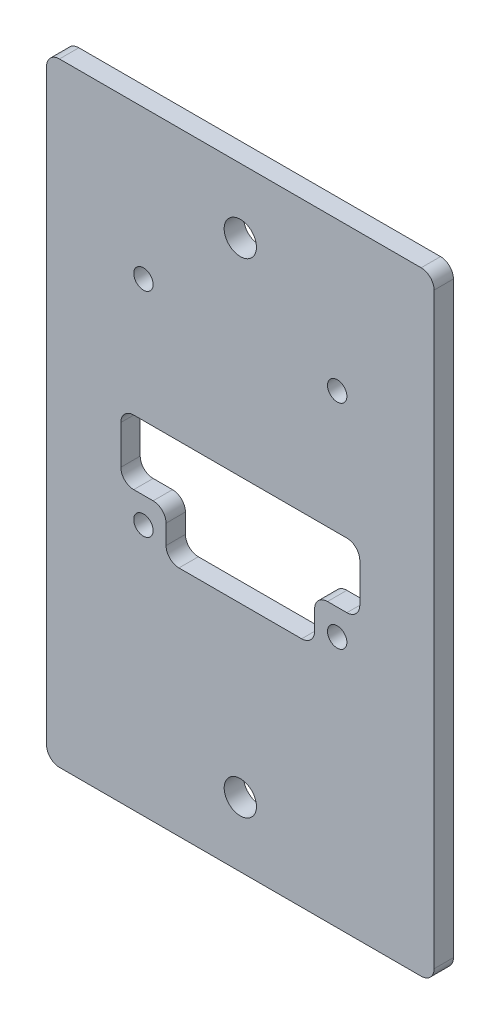
ISO-10303-21;
HEADER;
FILE_DESCRIPTION(('STEP AP214'),'2;1');
FILE_NAME('part.step','',(''),(''),'','','');
FILE_SCHEMA(('AUTOMOTIVE_DESIGN { 1 0 10303 214 1 1 1 1 }'));
ENDSEC;
DATA;
#1=APPLICATION_CONTEXT('core data for automotive mechanical design processes');
#2=APPLICATION_PROTOCOL_DEFINITION('international standard','automotive_design',2000,#1);
#3=PRODUCT_CONTEXT('',#1,'mechanical');
#4=PRODUCT('Part','Part','',(#3));
#5=PRODUCT_RELATED_PRODUCT_CATEGORY('part','',(#4));
#6=PRODUCT_DEFINITION_FORMATION('','',#4);
#7=PRODUCT_DEFINITION_CONTEXT('part definition',#1,'design');
#8=PRODUCT_DEFINITION('design','',#6,#7);
#9=PRODUCT_DEFINITION_SHAPE('','',#8);
#10=(LENGTH_UNIT() NAMED_UNIT(*) SI_UNIT(.MILLI.,.METRE.));
#11=(NAMED_UNIT(*) PLANE_ANGLE_UNIT() SI_UNIT($,.RADIAN.));
#12=(NAMED_UNIT(*) SI_UNIT($,.STERADIAN.) SOLID_ANGLE_UNIT());
#13=UNCERTAINTY_MEASURE_WITH_UNIT(LENGTH_MEASURE(1.E-05),#10,'distance_accuracy_value','');
#14=(GEOMETRIC_REPRESENTATION_CONTEXT(3) GLOBAL_UNCERTAINTY_ASSIGNED_CONTEXT((#13)) GLOBAL_UNIT_ASSIGNED_CONTEXT((#10,
#11,#12)) REPRESENTATION_CONTEXT('',''));
#15=CARTESIAN_POINT('',(0.,0.,0.));
#16=DIRECTION('',(0.,0.,1.));
#17=DIRECTION('',(1.,0.,0.));
#18=AXIS2_PLACEMENT_3D('',#15,#16,#17);
#19=CARTESIAN_POINT('',(-28.,-45.5,3.));
#20=DIRECTION('',(0.,0.,-1.));
#21=DIRECTION('',(-1.,0.,0.));
#22=AXIS2_PLACEMENT_3D('',#19,#20,#21);
#23=PLANE('',#22);
#24=CARTESIAN_POINT('',(15.,-8.5,3.));
#25=DIRECTION('',(0.,0.,1.));
#26=DIRECTION('',(1.,0.,0.));
#27=AXIS2_PLACEMENT_3D('',#24,#25,#26);
#28=CIRCLE('',#27,1.5);
#29=CARTESIAN_POINT('',(16.5,-8.5,3.));
#30=VERTEX_POINT('',#29);
#31=EDGE_CURVE('E374',#30,#30,#28,.T.);
#32=ORIENTED_EDGE('',*,*,#31,.F.);
#33=EDGE_LOOP('',(#32));
#34=FACE_BOUND('',#33,.T.);
#35=CARTESIAN_POINT('',(-15.,-8.5,3.));
#36=DIRECTION('',(0.,0.,1.));
#37=DIRECTION('',(1.,0.,0.));
#38=AXIS2_PLACEMENT_3D('',#35,#36,#37);
#39=CIRCLE('',#38,1.5);
#40=CARTESIAN_POINT('',(-13.5,-8.5,3.));
#41=VERTEX_POINT('',#40);
#42=EDGE_CURVE('E382',#41,#41,#39,.T.);
#43=ORIENTED_EDGE('',*,*,#42,.F.);
#44=EDGE_LOOP('',(#43));
#45=FACE_BOUND('',#44,.T.);
#46=CARTESIAN_POINT('',(15.,24.5,3.));
#47=DIRECTION('',(0.,0.,1.));
#48=DIRECTION('',(1.,0.,0.));
#49=AXIS2_PLACEMENT_3D('',#46,#47,#48);
#50=CIRCLE('',#49,1.5);
#51=CARTESIAN_POINT('',(16.5,24.5,3.));
#52=VERTEX_POINT('',#51);
#53=EDGE_CURVE('E390',#52,#52,#50,.T.);
#54=ORIENTED_EDGE('',*,*,#53,.F.);
#55=EDGE_LOOP('',(#54));
#56=FACE_BOUND('',#55,.T.);
#57=CARTESIAN_POINT('',(-15.,24.5,3.));
#58=DIRECTION('',(0.,0.,1.));
#59=DIRECTION('',(1.,0.,0.));
#60=AXIS2_PLACEMENT_3D('',#57,#58,#59);
#61=CIRCLE('',#60,1.5);
#62=CARTESIAN_POINT('',(-13.5,24.5,3.));
#63=VERTEX_POINT('',#62);
#64=EDGE_CURVE('E398',#63,#63,#61,.T.);
#65=ORIENTED_EDGE('',*,*,#64,.F.);
#66=EDGE_LOOP('',(#65));
#67=FACE_BOUND('',#66,.T.);
#68=CARTESIAN_POINT('',(0.,-37.5,3.));
#69=DIRECTION('',(0.,0.,1.));
#70=DIRECTION('',(1.,0.,0.));
#71=AXIS2_PLACEMENT_3D('',#68,#69,#70);
#72=CIRCLE('',#71,2.5);
#73=CARTESIAN_POINT('',(2.5,-37.5,3.));
#74=VERTEX_POINT('',#73);
#75=EDGE_CURVE('E406',#74,#74,#72,.T.);
#76=ORIENTED_EDGE('',*,*,#75,.F.);
#77=EDGE_LOOP('',(#76));
#78=FACE_BOUND('',#77,.T.);
#79=CARTESIAN_POINT('',(0.,37.5,3.));
#80=DIRECTION('',(0.,0.,1.));
#81=DIRECTION('',(1.,0.,0.));
#82=AXIS2_PLACEMENT_3D('',#79,#80,#81);
#83=CIRCLE('',#82,2.5);
#84=CARTESIAN_POINT('',(2.5,37.5,3.));
#85=VERTEX_POINT('',#84);
#86=EDGE_CURVE('E414',#85,#85,#83,.T.);
#87=ORIENTED_EDGE('',*,*,#86,.F.);
#88=EDGE_LOOP('',(#87));
#89=FACE_BOUND('',#88,.T.);
#90=CARTESIAN_POINT('',(-28.,-45.5,3.));
#91=DIRECTION('',(0.,0.,1.));
#92=DIRECTION('',(-1.,0.,0.));
#93=AXIS2_PLACEMENT_3D('',#90,#91,#92);
#94=CIRCLE('',#93,2.);
#95=CARTESIAN_POINT('',(-30.,-45.5,3.));
#96=VERTEX_POINT('',#95);
#97=CARTESIAN_POINT('',(-28.,-47.5,3.));
#98=VERTEX_POINT('',#97);
#99=EDGE_CURVE('E422',#96,#98,#94,.T.);
#100=ORIENTED_EDGE('',*,*,#99,.T.);
#101=DIRECTION('',(1.,0.,0.));
#102=VECTOR('',#101,1.);
#103=CARTESIAN_POINT('',(-28.,-47.5,3.));
#104=LINE('',#103,#102);
#105=CARTESIAN_POINT('',(28.,-47.5,3.));
#106=VERTEX_POINT('',#105);
#107=EDGE_CURVE('E426',#98,#106,#104,.T.);
#108=ORIENTED_EDGE('',*,*,#107,.T.);
#109=CARTESIAN_POINT('',(28.,-45.5,3.));
#110=DIRECTION('',(0.,0.,1.));
#111=DIRECTION('',(1.,0.,0.));
#112=AXIS2_PLACEMENT_3D('',#109,#110,#111);
#113=CIRCLE('',#112,2.);
#114=CARTESIAN_POINT('',(30.,-45.5,3.));
#115=VERTEX_POINT('',#114);
#116=EDGE_CURVE('E430',#106,#115,#113,.T.);
#117=ORIENTED_EDGE('',*,*,#116,.T.);
#118=DIRECTION('',(0.,1.,0.));
#119=VECTOR('',#118,1.);
#120=CARTESIAN_POINT('',(30.,-45.5,3.));
#121=LINE('',#120,#119);
#122=CARTESIAN_POINT('',(30.,45.5,3.));
#123=VERTEX_POINT('',#122);
#124=EDGE_CURVE('E433',#115,#123,#121,.T.);
#125=ORIENTED_EDGE('',*,*,#124,.T.);
#126=CARTESIAN_POINT('',(28.,45.5,3.));
#127=DIRECTION('',(0.,0.,1.));
#128=DIRECTION('',(-1.,0.,0.));
#129=AXIS2_PLACEMENT_3D('',#126,#127,#128);
#130=CIRCLE('',#129,2.);
#131=CARTESIAN_POINT('',(28.,47.5,3.));
#132=VERTEX_POINT('',#131);
#133=EDGE_CURVE('E436',#123,#132,#130,.T.);
#134=ORIENTED_EDGE('',*,*,#133,.T.);
#135=DIRECTION('',(-1.,0.,0.));
#136=VECTOR('',#135,1.);
#137=CARTESIAN_POINT('',(-28.,47.5,3.));
#138=LINE('',#137,#136);
#139=CARTESIAN_POINT('',(-28.,47.5,3.));
#140=VERTEX_POINT('',#139);
#141=EDGE_CURVE('E439',#132,#140,#138,.T.);
#142=ORIENTED_EDGE('',*,*,#141,.T.);
#143=CARTESIAN_POINT('',(-28.,45.5,3.));
#144=DIRECTION('',(0.,0.,1.));
#145=DIRECTION('',(-1.,0.,0.));
#146=AXIS2_PLACEMENT_3D('',#143,#144,#145);
#147=CIRCLE('',#146,2.);
#148=CARTESIAN_POINT('',(-30.,45.5,3.));
#149=VERTEX_POINT('',#148);
#150=EDGE_CURVE('E442',#140,#149,#147,.T.);
#151=ORIENTED_EDGE('',*,*,#150,.T.);
#152=DIRECTION('',(0.,-1.,0.));
#153=VECTOR('',#152,1.);
#154=CARTESIAN_POINT('',(-30.,-45.5,3.));
#155=LINE('',#154,#153);
#156=EDGE_CURVE('E445',#149,#96,#155,.T.);
#157=ORIENTED_EDGE('',*,*,#156,.T.);
#158=EDGE_LOOP('',(#100,#108,#117,#125,#134,#142,#151,#157));
#159=FACE_BOUND('',#158,.T.);
#160=CARTESIAN_POINT('',(-16.5,-2.5,3.));
#161=DIRECTION('',(0.,0.,1.));
#162=DIRECTION('',(-1.,0.,0.));
#163=AXIS2_PLACEMENT_3D('',#160,#161,#162);
#164=CIRCLE('',#163,2.);
#165=CARTESIAN_POINT('',(-18.5,-2.49999999999999,3.));
#166=VERTEX_POINT('',#165);
#167=CARTESIAN_POINT('',(-16.5,-4.5,3.));
#168=VERTEX_POINT('',#167);
#169=EDGE_CURVE('E205',#166,#168,#164,.T.);
#170=ORIENTED_EDGE('',*,*,#169,.F.);
#171=DIRECTION('',(0.,-1.,0.));
#172=VECTOR('',#171,1.);
#173=CARTESIAN_POINT('',(-18.5,-2.49999999999999,3.));
#174=LINE('',#173,#172);
#175=CARTESIAN_POINT('',(-18.5,3.49999999999999,3.));
#176=VERTEX_POINT('',#175);
#177=EDGE_CURVE('E270',#176,#166,#174,.T.);
#178=ORIENTED_EDGE('',*,*,#177,.F.);
#179=CARTESIAN_POINT('',(-16.5,3.5,3.));
#180=DIRECTION('',(0.,0.,1.));
#181=DIRECTION('',(-1.,0.,0.));
#182=AXIS2_PLACEMENT_3D('',#179,#180,#181);
#183=CIRCLE('',#182,2.);
#184=CARTESIAN_POINT('',(-16.5,5.5,3.));
#185=VERTEX_POINT('',#184);
#186=EDGE_CURVE('E267',#185,#176,#183,.T.);
#187=ORIENTED_EDGE('',*,*,#186,.F.);
#188=DIRECTION('',(-1.,0.,0.));
#189=VECTOR('',#188,1.);
#190=CARTESIAN_POINT('',(-16.5,5.5,3.));
#191=LINE('',#190,#189);
#192=CARTESIAN_POINT('',(16.5,5.5,3.));
#193=VERTEX_POINT('',#192);
#194=EDGE_CURVE('E264',#193,#185,#191,.T.);
#195=ORIENTED_EDGE('',*,*,#194,.F.);
#196=CARTESIAN_POINT('',(16.5,3.5,3.));
#197=DIRECTION('',(0.,0.,1.));
#198=DIRECTION('',(-1.,0.,0.));
#199=AXIS2_PLACEMENT_3D('',#196,#197,#198);
#200=CIRCLE('',#199,2.);
#201=CARTESIAN_POINT('',(18.5,3.49999999999999,3.));
#202=VERTEX_POINT('',#201);
#203=EDGE_CURVE('E261',#202,#193,#200,.T.);
#204=ORIENTED_EDGE('',*,*,#203,.F.);
#205=DIRECTION('',(0.,1.,0.));
#206=VECTOR('',#205,1.);
#207=CARTESIAN_POINT('',(18.5,-2.49999999999999,3.));
#208=LINE('',#207,#206);
#209=CARTESIAN_POINT('',(18.5,-2.5,3.));
#210=VERTEX_POINT('',#209);
#211=EDGE_CURVE('E258',#210,#202,#208,.T.);
#212=ORIENTED_EDGE('',*,*,#211,.F.);
#213=CARTESIAN_POINT('',(16.5,-2.5,3.));
#214=DIRECTION('',(0.,0.,1.));
#215=DIRECTION('',(1.,0.,0.));
#216=AXIS2_PLACEMENT_3D('',#213,#214,#215);
#217=CIRCLE('',#216,2.);
#218=CARTESIAN_POINT('',(16.5,-4.5,3.));
#219=VERTEX_POINT('',#218);
#220=EDGE_CURVE('E255',#219,#210,#217,.T.);
#221=ORIENTED_EDGE('',*,*,#220,.F.);
#222=DIRECTION('',(1.,0.,0.));
#223=VECTOR('',#222,1.);
#224=CARTESIAN_POINT('',(13.5,-4.5,3.));
#225=LINE('',#224,#223);
#226=CARTESIAN_POINT('',(13.5,-4.5,3.));
#227=VERTEX_POINT('',#226);
#228=EDGE_CURVE('E252',#227,#219,#225,.T.);
#229=ORIENTED_EDGE('',*,*,#228,.F.);
#230=CARTESIAN_POINT('',(13.5,-6.5,3.));
#231=DIRECTION('',(0.,0.,-1.));
#232=DIRECTION('',(1.,0.,0.));
#233=AXIS2_PLACEMENT_3D('',#230,#231,#232);
#234=CIRCLE('',#233,2.);
#235=CARTESIAN_POINT('',(11.5,-6.50000000000001,3.));
#236=VERTEX_POINT('',#235);
#237=EDGE_CURVE('E249',#236,#227,#234,.T.);
#238=ORIENTED_EDGE('',*,*,#237,.F.);
#239=DIRECTION('',(0.,1.,0.));
#240=VECTOR('',#239,1.);
#241=CARTESIAN_POINT('',(11.5,-9.49999999999999,3.));
#242=LINE('',#241,#240);
#243=CARTESIAN_POINT('',(11.5,-9.49999999999999,3.));
#244=VERTEX_POINT('',#243);
#245=EDGE_CURVE('E246',#244,#236,#242,.T.);
#246=ORIENTED_EDGE('',*,*,#245,.F.);
#247=CARTESIAN_POINT('',(9.5,-9.5,3.));
#248=DIRECTION('',(0.,0.,1.));
#249=DIRECTION('',(-1.,0.,0.));
#250=AXIS2_PLACEMENT_3D('',#247,#248,#249);
#251=CIRCLE('',#250,2.);
#252=CARTESIAN_POINT('',(9.49999999999999,-11.5,3.));
#253=VERTEX_POINT('',#252);
#254=EDGE_CURVE('E243',#253,#244,#251,.T.);
#255=ORIENTED_EDGE('',*,*,#254,.F.);
#256=DIRECTION('',(1.,0.,0.));
#257=VECTOR('',#256,1.);
#258=CARTESIAN_POINT('',(-9.49999999999999,-11.5,3.));
#259=LINE('',#258,#257);
#260=CARTESIAN_POINT('',(-9.49999999999999,-11.5,3.));
#261=VERTEX_POINT('',#260);
#262=EDGE_CURVE('E240',#261,#253,#259,.T.);
#263=ORIENTED_EDGE('',*,*,#262,.F.);
#264=CARTESIAN_POINT('',(-9.5,-9.5,3.));
#265=DIRECTION('',(0.,0.,1.));
#266=DIRECTION('',(1.,0.,0.));
#267=AXIS2_PLACEMENT_3D('',#264,#265,#266);
#268=CIRCLE('',#267,2.);
#269=CARTESIAN_POINT('',(-11.5,-9.49999999999999,3.));
#270=VERTEX_POINT('',#269);
#271=EDGE_CURVE('E237',#270,#261,#268,.T.);
#272=ORIENTED_EDGE('',*,*,#271,.F.);
#273=DIRECTION('',(0.,-1.,0.));
#274=VECTOR('',#273,1.);
#275=CARTESIAN_POINT('',(-11.5,-9.49999999999999,3.));
#276=LINE('',#275,#274);
#277=CARTESIAN_POINT('',(-11.5,-6.50000000000001,3.));
#278=VERTEX_POINT('',#277);
#279=EDGE_CURVE('E232',#278,#270,#276,.T.);
#280=ORIENTED_EDGE('',*,*,#279,.F.);
#281=CARTESIAN_POINT('',(-13.5,-6.5,3.));
#282=DIRECTION('',(0.,0.,-1.));
#283=DIRECTION('',(1.,0.,0.));
#284=AXIS2_PLACEMENT_3D('',#281,#282,#283);
#285=CIRCLE('',#284,2.);
#286=CARTESIAN_POINT('',(-13.5,-4.5,3.));
#287=VERTEX_POINT('',#286);
#288=EDGE_CURVE('E228',#287,#278,#285,.T.);
#289=ORIENTED_EDGE('',*,*,#288,.F.);
#290=DIRECTION('',(1.,0.,0.));
#291=VECTOR('',#290,1.);
#292=CARTESIAN_POINT('',(-13.5,-4.5,3.));
#293=LINE('',#292,#291);
#294=EDGE_CURVE('E214',#168,#287,#293,.T.);
#295=ORIENTED_EDGE('',*,*,#294,.F.);
#296=EDGE_LOOP('',(#170,#178,#187,#195,#204,#212,#221,#229,#238,#246,#255,#263,#272,#280,#289,#295));
#297=FACE_BOUND('',#296,.T.);
#298=ADVANCED_FACE('F43',(#34,#45,#56,#67,#78,#89,#159,#297),#23,.F.);
#299=CARTESIAN_POINT('',(-28.,-45.5,0.));
#300=DIRECTION('',(0.,0.,-1.));
#301=DIRECTION('',(-1.,0.,0.));
#302=AXIS2_PLACEMENT_3D('',#299,#300,#301);
#303=PLANE('',#302);
#304=CARTESIAN_POINT('',(-15.,-8.5,0.));
#305=DIRECTION('',(0.,0.,1.));
#306=DIRECTION('',(1.,0.,0.));
#307=AXIS2_PLACEMENT_3D('',#304,#305,#306);
#308=CIRCLE('',#307,1.5);
#309=CARTESIAN_POINT('',(-13.5,-8.5,0.));
#310=VERTEX_POINT('',#309);
#311=EDGE_CURVE('E378',#310,#310,#308,.T.);
#312=ORIENTED_EDGE('',*,*,#311,.T.);
#313=EDGE_LOOP('',(#312));
#314=FACE_BOUND('',#313,.T.);
#315=CARTESIAN_POINT('',(-15.,24.5,0.));
#316=DIRECTION('',(0.,0.,1.));
#317=DIRECTION('',(1.,0.,0.));
#318=AXIS2_PLACEMENT_3D('',#315,#316,#317);
#319=CIRCLE('',#318,1.5);
#320=CARTESIAN_POINT('',(-13.5,24.5,0.));
#321=VERTEX_POINT('',#320);
#322=EDGE_CURVE('E394',#321,#321,#319,.T.);
#323=ORIENTED_EDGE('',*,*,#322,.T.);
#324=EDGE_LOOP('',(#323));
#325=FACE_BOUND('',#324,.T.);
#326=CARTESIAN_POINT('',(0.,37.5,0.));
#327=DIRECTION('',(0.,0.,1.));
#328=DIRECTION('',(1.,0.,0.));
#329=AXIS2_PLACEMENT_3D('',#326,#327,#328);
#330=CIRCLE('',#329,2.5);
#331=CARTESIAN_POINT('',(2.5,37.5,0.));
#332=VERTEX_POINT('',#331);
#333=EDGE_CURVE('E410',#332,#332,#330,.T.);
#334=ORIENTED_EDGE('',*,*,#333,.T.);
#335=EDGE_LOOP('',(#334));
#336=FACE_BOUND('',#335,.T.);
#337=CARTESIAN_POINT('',(-28.,-45.5,0.));
#338=DIRECTION('',(0.,0.,1.));
#339=DIRECTION('',(-1.,0.,0.));
#340=AXIS2_PLACEMENT_3D('',#337,#338,#339);
#341=CIRCLE('',#340,2.);
#342=CARTESIAN_POINT('',(-30.,-45.5,0.));
#343=VERTEX_POINT('',#342);
#344=CARTESIAN_POINT('',(-28.,-47.5,0.));
#345=VERTEX_POINT('',#344);
#346=EDGE_CURVE('E418',#343,#345,#341,.T.);
#347=ORIENTED_EDGE('',*,*,#346,.F.);
#348=DIRECTION('',(0.,-1.,0.));
#349=VECTOR('',#348,1.);
#350=CARTESIAN_POINT('',(-30.,-45.5,0.));
#351=LINE('',#350,#349);
#352=CARTESIAN_POINT('',(-30.,45.5,0.));
#353=VERTEX_POINT('',#352);
#354=EDGE_CURVE('E427',#353,#343,#351,.T.);
#355=ORIENTED_EDGE('',*,*,#354,.F.);
#356=CARTESIAN_POINT('',(-28.,45.5,0.));
#357=DIRECTION('',(0.,0.,1.));
#358=DIRECTION('',(-1.,0.,0.));
#359=AXIS2_PLACEMENT_3D('',#356,#357,#358);
#360=CIRCLE('',#359,2.);
#361=CARTESIAN_POINT('',(-28.,47.5,0.));
#362=VERTEX_POINT('',#361);
#363=EDGE_CURVE('E467',#362,#353,#360,.T.);
#364=ORIENTED_EDGE('',*,*,#363,.F.);
#365=DIRECTION('',(-1.,0.,0.));
#366=VECTOR('',#365,1.);
#367=CARTESIAN_POINT('',(-28.,47.5,0.));
#368=LINE('',#367,#366);
#369=CARTESIAN_POINT('',(28.,47.5,0.));
#370=VERTEX_POINT('',#369);
#371=EDGE_CURVE('E464',#370,#362,#368,.T.);
#372=ORIENTED_EDGE('',*,*,#371,.F.);
#373=CARTESIAN_POINT('',(28.,45.5,0.));
#374=DIRECTION('',(0.,0.,1.));
#375=DIRECTION('',(-1.,0.,0.));
#376=AXIS2_PLACEMENT_3D('',#373,#374,#375);
#377=CIRCLE('',#376,2.);
#378=CARTESIAN_POINT('',(30.,45.5,0.));
#379=VERTEX_POINT('',#378);
#380=EDGE_CURVE('E461',#379,#370,#377,.T.);
#381=ORIENTED_EDGE('',*,*,#380,.F.);
#382=DIRECTION('',(0.,1.,0.));
#383=VECTOR('',#382,1.);
#384=CARTESIAN_POINT('',(30.,-45.5,0.));
#385=LINE('',#384,#383);
#386=CARTESIAN_POINT('',(30.,-45.5,0.));
#387=VERTEX_POINT('',#386);
#388=EDGE_CURVE('E458',#387,#379,#385,.T.);
#389=ORIENTED_EDGE('',*,*,#388,.F.);
#390=CARTESIAN_POINT('',(28.,-45.5,0.));
#391=DIRECTION('',(0.,0.,1.));
#392=DIRECTION('',(1.,0.,0.));
#393=AXIS2_PLACEMENT_3D('',#390,#391,#392);
#394=CIRCLE('',#393,2.);
#395=CARTESIAN_POINT('',(28.,-47.5,0.));
#396=VERTEX_POINT('',#395);
#397=EDGE_CURVE('E455',#396,#387,#394,.T.);
#398=ORIENTED_EDGE('',*,*,#397,.F.);
#399=DIRECTION('',(1.,0.,0.));
#400=VECTOR('',#399,1.);
#401=CARTESIAN_POINT('',(-28.,-47.5,0.));
#402=LINE('',#401,#400);
#403=EDGE_CURVE('E452',#345,#396,#402,.T.);
#404=ORIENTED_EDGE('',*,*,#403,.F.);
#405=EDGE_LOOP('',(#347,#355,#364,#372,#381,#389,#398,#404));
#406=FACE_BOUND('',#405,.T.);
#407=CARTESIAN_POINT('',(0.,-37.5,0.));
#408=DIRECTION('',(0.,0.,1.));
#409=DIRECTION('',(1.,0.,0.));
#410=AXIS2_PLACEMENT_3D('',#407,#408,#409);
#411=CIRCLE('',#410,2.5);
#412=CARTESIAN_POINT('',(2.5,-37.5,0.));
#413=VERTEX_POINT('',#412);
#414=EDGE_CURVE('E402',#413,#413,#411,.T.);
#415=ORIENTED_EDGE('',*,*,#414,.T.);
#416=EDGE_LOOP('',(#415));
#417=FACE_BOUND('',#416,.T.);
#418=CARTESIAN_POINT('',(15.,24.5,0.));
#419=DIRECTION('',(0.,0.,1.));
#420=DIRECTION('',(1.,0.,0.));
#421=AXIS2_PLACEMENT_3D('',#418,#419,#420);
#422=CIRCLE('',#421,1.5);
#423=CARTESIAN_POINT('',(16.5,24.5,0.));
#424=VERTEX_POINT('',#423);
#425=EDGE_CURVE('E386',#424,#424,#422,.T.);
#426=ORIENTED_EDGE('',*,*,#425,.T.);
#427=EDGE_LOOP('',(#426));
#428=FACE_BOUND('',#427,.T.);
#429=CARTESIAN_POINT('',(15.,-8.5,0.));
#430=DIRECTION('',(0.,0.,1.));
#431=DIRECTION('',(1.,0.,0.));
#432=AXIS2_PLACEMENT_3D('',#429,#430,#431);
#433=CIRCLE('',#432,1.5);
#434=CARTESIAN_POINT('',(16.5,-8.5,0.));
#435=VERTEX_POINT('',#434);
#436=EDGE_CURVE('E223',#435,#435,#433,.T.);
#437=ORIENTED_EDGE('',*,*,#436,.T.);
#438=EDGE_LOOP('',(#437));
#439=FACE_BOUND('',#438,.T.);
#440=DIRECTION('',(0.,-1.,0.));
#441=VECTOR('',#440,1.);
#442=CARTESIAN_POINT('',(-18.5,-2.49999999999999,0.));
#443=LINE('',#442,#441);
#444=CARTESIAN_POINT('',(-18.5,3.49999999999999,0.));
#445=VERTEX_POINT('',#444);
#446=CARTESIAN_POINT('',(-18.5,-2.49999999999999,0.));
#447=VERTEX_POINT('',#446);
#448=EDGE_CURVE('E215',#445,#447,#443,.T.);
#449=ORIENTED_EDGE('',*,*,#448,.T.);
#450=CARTESIAN_POINT('',(-16.5,-2.5,0.));
#451=DIRECTION('',(0.,0.,1.));
#452=DIRECTION('',(-1.,0.,0.));
#453=AXIS2_PLACEMENT_3D('',#450,#451,#452);
#454=CIRCLE('',#453,2.);
#455=CARTESIAN_POINT('',(-16.5,-4.5,0.));
#456=VERTEX_POINT('',#455);
#457=EDGE_CURVE('E67',#447,#456,#454,.T.);
#458=ORIENTED_EDGE('',*,*,#457,.T.);
#459=DIRECTION('',(1.,0.,0.));
#460=VECTOR('',#459,1.);
#461=CARTESIAN_POINT('',(-13.5,-4.5,0.));
#462=LINE('',#461,#460);
#463=CARTESIAN_POINT('',(-13.5,-4.5,0.));
#464=VERTEX_POINT('',#463);
#465=EDGE_CURVE('E221',#456,#464,#462,.T.);
#466=ORIENTED_EDGE('',*,*,#465,.T.);
#467=CARTESIAN_POINT('',(-13.5,-6.5,0.));
#468=DIRECTION('',(0.,0.,-1.));
#469=DIRECTION('',(1.,0.,0.));
#470=AXIS2_PLACEMENT_3D('',#467,#468,#469);
#471=CIRCLE('',#470,2.);
#472=CARTESIAN_POINT('',(-11.5,-6.50000000000001,0.));
#473=VERTEX_POINT('',#472);
#474=EDGE_CURVE('E277',#464,#473,#471,.T.);
#475=ORIENTED_EDGE('',*,*,#474,.T.);
#476=DIRECTION('',(0.,-1.,0.));
#477=VECTOR('',#476,1.);
#478=CARTESIAN_POINT('',(-11.5,-9.49999999999999,0.));
#479=LINE('',#478,#477);
#480=CARTESIAN_POINT('',(-11.5,-9.49999999999999,0.));
#481=VERTEX_POINT('',#480);
#482=EDGE_CURVE('E281',#473,#481,#479,.T.);
#483=ORIENTED_EDGE('',*,*,#482,.T.);
#484=CARTESIAN_POINT('',(-9.5,-9.5,0.));
#485=DIRECTION('',(0.,0.,1.));
#486=DIRECTION('',(1.,0.,0.));
#487=AXIS2_PLACEMENT_3D('',#484,#485,#486);
#488=CIRCLE('',#487,2.);
#489=CARTESIAN_POINT('',(-9.49999999999999,-11.5,0.));
#490=VERTEX_POINT('',#489);
#491=EDGE_CURVE('E285',#481,#490,#488,.T.);
#492=ORIENTED_EDGE('',*,*,#491,.T.);
#493=DIRECTION('',(1.,0.,0.));
#494=VECTOR('',#493,1.);
#495=CARTESIAN_POINT('',(-9.49999999999999,-11.5,0.));
#496=LINE('',#495,#494);
#497=CARTESIAN_POINT('',(9.49999999999999,-11.5,0.));
#498=VERTEX_POINT('',#497);
#499=EDGE_CURVE('E289',#490,#498,#496,.T.);
#500=ORIENTED_EDGE('',*,*,#499,.T.);
#501=CARTESIAN_POINT('',(9.5,-9.5,0.));
#502=DIRECTION('',(0.,0.,1.));
#503=DIRECTION('',(-1.,0.,0.));
#504=AXIS2_PLACEMENT_3D('',#501,#502,#503);
#505=CIRCLE('',#504,2.);
#506=CARTESIAN_POINT('',(11.5,-9.49999999999999,0.));
#507=VERTEX_POINT('',#506);
#508=EDGE_CURVE('E293',#498,#507,#505,.T.);
#509=ORIENTED_EDGE('',*,*,#508,.T.);
#510=DIRECTION('',(0.,1.,0.));
#511=VECTOR('',#510,1.);
#512=CARTESIAN_POINT('',(11.5,-9.49999999999999,0.));
#513=LINE('',#512,#511);
#514=CARTESIAN_POINT('',(11.5,-6.50000000000001,0.));
#515=VERTEX_POINT('',#514);
#516=EDGE_CURVE('E297',#507,#515,#513,.T.);
#517=ORIENTED_EDGE('',*,*,#516,.T.);
#518=CARTESIAN_POINT('',(13.5,-6.5,0.));
#519=DIRECTION('',(0.,0.,-1.));
#520=DIRECTION('',(1.,0.,0.));
#521=AXIS2_PLACEMENT_3D('',#518,#519,#520);
#522=CIRCLE('',#521,2.);
#523=CARTESIAN_POINT('',(13.5,-4.5,0.));
#524=VERTEX_POINT('',#523);
#525=EDGE_CURVE('E301',#515,#524,#522,.T.);
#526=ORIENTED_EDGE('',*,*,#525,.T.);
#527=DIRECTION('',(1.,0.,0.));
#528=VECTOR('',#527,1.);
#529=CARTESIAN_POINT('',(13.5,-4.5,0.));
#530=LINE('',#529,#528);
#531=CARTESIAN_POINT('',(16.5,-4.5,0.));
#532=VERTEX_POINT('',#531);
#533=EDGE_CURVE('E305',#524,#532,#530,.T.);
#534=ORIENTED_EDGE('',*,*,#533,.T.);
#535=CARTESIAN_POINT('',(16.5,-2.5,0.));
#536=DIRECTION('',(0.,0.,1.));
#537=DIRECTION('',(1.,0.,0.));
#538=AXIS2_PLACEMENT_3D('',#535,#536,#537);
#539=CIRCLE('',#538,2.);
#540=CARTESIAN_POINT('',(18.5,-2.5,0.));
#541=VERTEX_POINT('',#540);
#542=EDGE_CURVE('E309',#532,#541,#539,.T.);
#543=ORIENTED_EDGE('',*,*,#542,.T.);
#544=DIRECTION('',(0.,1.,0.));
#545=VECTOR('',#544,1.);
#546=CARTESIAN_POINT('',(18.5,-2.49999999999999,0.));
#547=LINE('',#546,#545);
#548=CARTESIAN_POINT('',(18.5,3.49999999999999,0.));
#549=VERTEX_POINT('',#548);
#550=EDGE_CURVE('E313',#541,#549,#547,.T.);
#551=ORIENTED_EDGE('',*,*,#550,.T.);
#552=CARTESIAN_POINT('',(16.5,3.5,0.));
#553=DIRECTION('',(0.,0.,1.));
#554=DIRECTION('',(-1.,0.,0.));
#555=AXIS2_PLACEMENT_3D('',#552,#553,#554);
#556=CIRCLE('',#555,2.);
#557=CARTESIAN_POINT('',(16.5,5.5,0.));
#558=VERTEX_POINT('',#557);
#559=EDGE_CURVE('E317',#549,#558,#556,.T.);
#560=ORIENTED_EDGE('',*,*,#559,.T.);
#561=DIRECTION('',(-1.,0.,0.));
#562=VECTOR('',#561,1.);
#563=CARTESIAN_POINT('',(-16.5,5.5,0.));
#564=LINE('',#563,#562);
#565=CARTESIAN_POINT('',(-16.5,5.5,0.));
#566=VERTEX_POINT('',#565);
#567=EDGE_CURVE('E321',#558,#566,#564,.T.);
#568=ORIENTED_EDGE('',*,*,#567,.T.);
#569=CARTESIAN_POINT('',(-16.5,3.5,0.));
#570=DIRECTION('',(0.,0.,1.));
#571=DIRECTION('',(-1.,0.,0.));
#572=AXIS2_PLACEMENT_3D('',#569,#570,#571);
#573=CIRCLE('',#572,2.);
#574=EDGE_CURVE('E325',#566,#445,#573,.T.);
#575=ORIENTED_EDGE('',*,*,#574,.T.);
#576=EDGE_LOOP('',(#449,#458,#466,#475,#483,#492,#500,#509,#517,#526,#534,#543,#551,#560,#568,#575));
#577=FACE_BOUND('',#576,.T.);
#578=ADVANCED_FACE('F506',(#314,#325,#336,#406,#417,#428,#439,#577),#303,.T.);
#579=CARTESIAN_POINT('',(-28.,-45.5,3.));
#580=DIRECTION('',(0.,0.,-1.));
#581=DIRECTION('',(-1.,0.,0.));
#582=AXIS2_PLACEMENT_3D('',#579,#580,#581);
#583=CYLINDRICAL_SURFACE('',#582,2.);
#584=ORIENTED_EDGE('',*,*,#346,.T.);
#585=DIRECTION('',(0.,0.,-1.));
#586=VECTOR('',#585,1.);
#587=CARTESIAN_POINT('',(-28.,-47.5,3.));
#588=LINE('',#587,#586);
#589=EDGE_CURVE('E11',#98,#345,#588,.T.);
#590=ORIENTED_EDGE('',*,*,#589,.F.);
#591=ORIENTED_EDGE('',*,*,#99,.F.);
#592=DIRECTION('',(0.,0.,-1.));
#593=VECTOR('',#592,1.);
#594=CARTESIAN_POINT('',(-30.,-45.5,3.));
#595=LINE('',#594,#593);
#596=EDGE_CURVE('E448',#96,#343,#595,.T.);
#597=ORIENTED_EDGE('',*,*,#596,.T.);
#598=EDGE_LOOP('',(#584,#590,#591,#597));
#599=FACE_BOUND('',#598,.T.);
#600=ADVANCED_FACE('F45',(#599),#583,.T.);
#601=CARTESIAN_POINT('',(-28.,-47.5,3.));
#602=DIRECTION('',(0.,1.,0.));
#603=DIRECTION('',(0.,0.,1.));
#604=AXIS2_PLACEMENT_3D('',#601,#602,#603);
#605=PLANE('',#604);
#606=ORIENTED_EDGE('',*,*,#403,.T.);
#607=DIRECTION('',(0.,0.,-1.));
#608=VECTOR('',#607,1.);
#609=CARTESIAN_POINT('',(28.,-47.5,3.));
#610=LINE('',#609,#608);
#611=EDGE_CURVE('E52',#106,#396,#610,.T.);
#612=ORIENTED_EDGE('',*,*,#611,.F.);
#613=ORIENTED_EDGE('',*,*,#107,.F.);
#614=ORIENTED_EDGE('',*,*,#589,.T.);
#615=EDGE_LOOP('',(#606,#612,#613,#614));
#616=FACE_BOUND('',#615,.T.);
#617=ADVANCED_FACE('F523',(#616),#605,.F.);
#618=CARTESIAN_POINT('',(28.,-45.5,3.));
#619=DIRECTION('',(0.,0.,-1.));
#620=DIRECTION('',(-1.,0.,0.));
#621=AXIS2_PLACEMENT_3D('',#618,#619,#620);
#622=CYLINDRICAL_SURFACE('',#621,2.);
#623=ORIENTED_EDGE('',*,*,#397,.T.);
#624=DIRECTION('',(0.,0.,-1.));
#625=VECTOR('',#624,1.);
#626=CARTESIAN_POINT('',(30.,-45.5,3.));
#627=LINE('',#626,#625);
#628=EDGE_CURVE('E491',#115,#387,#627,.T.);
#629=ORIENTED_EDGE('',*,*,#628,.F.);
#630=ORIENTED_EDGE('',*,*,#116,.F.);
#631=ORIENTED_EDGE('',*,*,#611,.T.);
#632=EDGE_LOOP('',(#623,#629,#630,#631));
#633=FACE_BOUND('',#632,.T.);
#634=ADVANCED_FACE('F500',(#633),#622,.T.);
#635=CARTESIAN_POINT('',(30.,-45.5,3.));
#636=DIRECTION('',(-1.,0.,0.));
#637=DIRECTION('',(0.,0.,1.));
#638=AXIS2_PLACEMENT_3D('',#635,#636,#637);
#639=PLANE('',#638);
#640=ORIENTED_EDGE('',*,*,#388,.T.);
#641=DIRECTION('',(0.,0.,-1.));
#642=VECTOR('',#641,1.);
#643=CARTESIAN_POINT('',(30.,45.5,3.));
#644=LINE('',#643,#642);
#645=EDGE_CURVE('E487',#123,#379,#644,.T.);
#646=ORIENTED_EDGE('',*,*,#645,.F.);
#647=ORIENTED_EDGE('',*,*,#124,.F.);
#648=ORIENTED_EDGE('',*,*,#628,.T.);
#649=EDGE_LOOP('',(#640,#646,#647,#648));
#650=FACE_BOUND('',#649,.T.);
#651=ADVANCED_FACE('F512',(#650),#639,.F.);
#652=CARTESIAN_POINT('',(28.,45.5,3.));
#653=DIRECTION('',(0.,0.,-1.));
#654=DIRECTION('',(-1.,0.,0.));
#655=AXIS2_PLACEMENT_3D('',#652,#653,#654);
#656=CYLINDRICAL_SURFACE('',#655,2.);
#657=ORIENTED_EDGE('',*,*,#380,.T.);
#658=DIRECTION('',(0.,0.,-1.));
#659=VECTOR('',#658,1.);
#660=CARTESIAN_POINT('',(28.,47.5,3.));
#661=LINE('',#660,#659);
#662=EDGE_CURVE('E483',#132,#370,#661,.T.);
#663=ORIENTED_EDGE('',*,*,#662,.F.);
#664=ORIENTED_EDGE('',*,*,#133,.F.);
#665=ORIENTED_EDGE('',*,*,#645,.T.);
#666=EDGE_LOOP('',(#657,#663,#664,#665));
#667=FACE_BOUND('',#666,.T.);
#668=ADVANCED_FACE('F516',(#667),#656,.T.);
#669=CARTESIAN_POINT('',(-28.,47.5,3.));
#670=DIRECTION('',(0.,-1.,0.));
#671=DIRECTION('',(0.,0.,-1.));
#672=AXIS2_PLACEMENT_3D('',#669,#670,#671);
#673=PLANE('',#672);
#674=ORIENTED_EDGE('',*,*,#371,.T.);
#675=DIRECTION('',(0.,0.,-1.));
#676=VECTOR('',#675,1.);
#677=CARTESIAN_POINT('',(-28.,47.5,3.));
#678=LINE('',#677,#676);
#679=EDGE_CURVE('E479',#140,#362,#678,.T.);
#680=ORIENTED_EDGE('',*,*,#679,.F.);
#681=ORIENTED_EDGE('',*,*,#141,.F.);
#682=ORIENTED_EDGE('',*,*,#662,.T.);
#683=EDGE_LOOP('',(#674,#680,#681,#682));
#684=FACE_BOUND('',#683,.T.);
#685=ADVANCED_FACE('F536',(#684),#673,.F.);
#686=CARTESIAN_POINT('',(-28.,45.5,3.));
#687=DIRECTION('',(0.,0.,-1.));
#688=DIRECTION('',(-1.,0.,0.));
#689=AXIS2_PLACEMENT_3D('',#686,#687,#688);
#690=CYLINDRICAL_SURFACE('',#689,2.);
#691=ORIENTED_EDGE('',*,*,#363,.T.);
#692=DIRECTION('',(0.,0.,-1.));
#693=VECTOR('',#692,1.);
#694=CARTESIAN_POINT('',(-30.,45.5,3.));
#695=LINE('',#694,#693);
#696=EDGE_CURVE('E475',#149,#353,#695,.T.);
#697=ORIENTED_EDGE('',*,*,#696,.F.);
#698=ORIENTED_EDGE('',*,*,#150,.F.);
#699=ORIENTED_EDGE('',*,*,#679,.T.);
#700=EDGE_LOOP('',(#691,#697,#698,#699));
#701=FACE_BOUND('',#700,.T.);
#702=ADVANCED_FACE('F534',(#701),#690,.T.);
#703=CARTESIAN_POINT('',(-30.,-45.5,3.));
#704=DIRECTION('',(1.,0.,0.));
#705=DIRECTION('',(0.,0.,-1.));
#706=AXIS2_PLACEMENT_3D('',#703,#704,#705);
#707=PLANE('',#706);
#708=ORIENTED_EDGE('',*,*,#354,.T.);
#709=ORIENTED_EDGE('',*,*,#596,.F.);
#710=ORIENTED_EDGE('',*,*,#156,.F.);
#711=ORIENTED_EDGE('',*,*,#696,.T.);
#712=EDGE_LOOP('',(#708,#709,#710,#711));
#713=FACE_BOUND('',#712,.T.);
#714=ADVANCED_FACE('F529',(#713),#707,.F.);
#715=CARTESIAN_POINT('',(0.,37.5,3.));
#716=DIRECTION('',(0.,0.,-1.));
#717=DIRECTION('',(-1.,0.,0.));
#718=AXIS2_PLACEMENT_3D('',#715,#716,#717);
#719=CYLINDRICAL_SURFACE('',#718,2.5);
#720=ORIENTED_EDGE('',*,*,#86,.T.);
#721=EDGE_LOOP('',(#720));
#722=FACE_BOUND('',#721,.T.);
#723=ORIENTED_EDGE('',*,*,#333,.F.);
#724=EDGE_LOOP('',(#723));
#725=FACE_BOUND('',#724,.T.);
#726=ADVANCED_FACE('F556',(#722,#725),#719,.F.);
#727=CARTESIAN_POINT('',(0.,-37.5,3.));
#728=DIRECTION('',(0.,0.,-1.));
#729=DIRECTION('',(-1.,0.,0.));
#730=AXIS2_PLACEMENT_3D('',#727,#728,#729);
#731=CYLINDRICAL_SURFACE('',#730,2.5);
#732=ORIENTED_EDGE('',*,*,#75,.T.);
#733=EDGE_LOOP('',(#732));
#734=FACE_BOUND('',#733,.T.);
#735=ORIENTED_EDGE('',*,*,#414,.F.);
#736=EDGE_LOOP('',(#735));
#737=FACE_BOUND('',#736,.T.);
#738=ADVANCED_FACE('F563',(#734,#737),#731,.F.);
#739=CARTESIAN_POINT('',(-15.,24.5,3.));
#740=DIRECTION('',(0.,0.,-1.));
#741=DIRECTION('',(-1.,0.,0.));
#742=AXIS2_PLACEMENT_3D('',#739,#740,#741);
#743=CYLINDRICAL_SURFACE('',#742,1.5);
#744=ORIENTED_EDGE('',*,*,#64,.T.);
#745=EDGE_LOOP('',(#744));
#746=FACE_BOUND('',#745,.T.);
#747=ORIENTED_EDGE('',*,*,#322,.F.);
#748=EDGE_LOOP('',(#747));
#749=FACE_BOUND('',#748,.T.);
#750=ADVANCED_FACE('F568',(#746,#749),#743,.F.);
#751=CARTESIAN_POINT('',(15.,24.5,3.));
#752=DIRECTION('',(0.,0.,-1.));
#753=DIRECTION('',(-1.,0.,0.));
#754=AXIS2_PLACEMENT_3D('',#751,#752,#753);
#755=CYLINDRICAL_SURFACE('',#754,1.5);
#756=ORIENTED_EDGE('',*,*,#53,.T.);
#757=EDGE_LOOP('',(#756));
#758=FACE_BOUND('',#757,.T.);
#759=ORIENTED_EDGE('',*,*,#425,.F.);
#760=EDGE_LOOP('',(#759));
#761=FACE_BOUND('',#760,.T.);
#762=ADVANCED_FACE('F578',(#758,#761),#755,.F.);
#763=CARTESIAN_POINT('',(-15.,-8.5,3.));
#764=DIRECTION('',(0.,0.,-1.));
#765=DIRECTION('',(-1.,0.,0.));
#766=AXIS2_PLACEMENT_3D('',#763,#764,#765);
#767=CYLINDRICAL_SURFACE('',#766,1.5);
#768=ORIENTED_EDGE('',*,*,#42,.T.);
#769=EDGE_LOOP('',(#768));
#770=FACE_BOUND('',#769,.T.);
#771=ORIENTED_EDGE('',*,*,#311,.F.);
#772=EDGE_LOOP('',(#771));
#773=FACE_BOUND('',#772,.T.);
#774=ADVANCED_FACE('F585',(#770,#773),#767,.F.);
#775=CARTESIAN_POINT('',(15.,-8.5,3.));
#776=DIRECTION('',(0.,0.,-1.));
#777=DIRECTION('',(-1.,0.,0.));
#778=AXIS2_PLACEMENT_3D('',#775,#776,#777);
#779=CYLINDRICAL_SURFACE('',#778,1.5);
#780=ORIENTED_EDGE('',*,*,#31,.T.);
#781=EDGE_LOOP('',(#780));
#782=FACE_BOUND('',#781,.T.);
#783=ORIENTED_EDGE('',*,*,#436,.F.);
#784=EDGE_LOOP('',(#783));
#785=FACE_BOUND('',#784,.T.);
#786=ADVANCED_FACE('F589',(#782,#785),#779,.F.);
#787=CARTESIAN_POINT('',(-16.5,-2.5,3.));
#788=DIRECTION('',(0.,0.,-1.));
#789=DIRECTION('',(-1.,0.,0.));
#790=AXIS2_PLACEMENT_3D('',#787,#788,#789);
#791=CYLINDRICAL_SURFACE('',#790,2.);
#792=ORIENTED_EDGE('',*,*,#457,.F.);
#793=DIRECTION('',(0.,0.,-1.));
#794=VECTOR('',#793,1.);
#795=CARTESIAN_POINT('',(-18.5,-2.49999999999999,3.));
#796=LINE('',#795,#794);
#797=EDGE_CURVE('E209',#166,#447,#796,.T.);
#798=ORIENTED_EDGE('',*,*,#797,.F.);
#799=ORIENTED_EDGE('',*,*,#169,.T.);
#800=DIRECTION('',(0.,0.,-1.));
#801=VECTOR('',#800,1.);
#802=CARTESIAN_POINT('',(-16.5,-4.5,3.));
#803=LINE('',#802,#801);
#804=EDGE_CURVE('E208',#168,#456,#803,.T.);
#805=ORIENTED_EDGE('',*,*,#804,.T.);
#806=EDGE_LOOP('',(#792,#798,#799,#805));
#807=FACE_BOUND('',#806,.T.);
#808=ADVANCED_FACE('F207',(#807),#791,.F.);
#809=CARTESIAN_POINT('',(-13.5,-4.5,3.));
#810=DIRECTION('',(0.,1.,0.));
#811=DIRECTION('',(-1.,0.,0.));
#812=AXIS2_PLACEMENT_3D('',#809,#810,#811);
#813=PLANE('',#812);
#814=ORIENTED_EDGE('',*,*,#465,.F.);
#815=ORIENTED_EDGE('',*,*,#804,.F.);
#816=ORIENTED_EDGE('',*,*,#294,.T.);
#817=DIRECTION('',(0.,0.,-1.));
#818=VECTOR('',#817,1.);
#819=CARTESIAN_POINT('',(-13.5,-4.5,3.));
#820=LINE('',#819,#818);
#821=EDGE_CURVE('E224',#287,#464,#820,.T.);
#822=ORIENTED_EDGE('',*,*,#821,.T.);
#823=EDGE_LOOP('',(#814,#815,#816,#822));
#824=FACE_BOUND('',#823,.T.);
#825=ADVANCED_FACE('F218',(#824),#813,.T.);
#826=CARTESIAN_POINT('',(-13.5,-6.5,3.));
#827=DIRECTION('',(0.,0.,-1.));
#828=DIRECTION('',(-1.,0.,0.));
#829=AXIS2_PLACEMENT_3D('',#826,#827,#828);
#830=CYLINDRICAL_SURFACE('',#829,2.);
#831=ORIENTED_EDGE('',*,*,#474,.F.);
#832=ORIENTED_EDGE('',*,*,#821,.F.);
#833=ORIENTED_EDGE('',*,*,#288,.T.);
#834=DIRECTION('',(0.,0.,-1.));
#835=VECTOR('',#834,1.);
#836=CARTESIAN_POINT('',(-11.5,-6.50000000000001,3.));
#837=LINE('',#836,#835);
#838=EDGE_CURVE('E369',#278,#473,#837,.T.);
#839=ORIENTED_EDGE('',*,*,#838,.T.);
#840=EDGE_LOOP('',(#831,#832,#833,#839));
#841=FACE_BOUND('',#840,.T.);
#842=ADVANCED_FACE('F598',(#841),#830,.T.);
#843=CARTESIAN_POINT('',(-11.5,-9.49999999999999,3.));
#844=DIRECTION('',(1.,0.,0.));
#845=DIRECTION('',(0.,0.,-1.));
#846=AXIS2_PLACEMENT_3D('',#843,#844,#845);
#847=PLANE('',#846);
#848=ORIENTED_EDGE('',*,*,#482,.F.);
#849=ORIENTED_EDGE('',*,*,#838,.F.);
#850=ORIENTED_EDGE('',*,*,#279,.T.);
#851=DIRECTION('',(0.,0.,-1.));
#852=VECTOR('',#851,1.);
#853=CARTESIAN_POINT('',(-11.5,-9.49999999999999,3.));
#854=LINE('',#853,#852);
#855=EDGE_CURVE('E366',#270,#481,#854,.T.);
#856=ORIENTED_EDGE('',*,*,#855,.T.);
#857=EDGE_LOOP('',(#848,#849,#850,#856));
#858=FACE_BOUND('',#857,.T.);
#859=ADVANCED_FACE('F601',(#858),#847,.T.);
#860=CARTESIAN_POINT('',(-9.5,-9.5,3.));
#861=DIRECTION('',(0.,0.,-1.));
#862=DIRECTION('',(-1.,0.,0.));
#863=AXIS2_PLACEMENT_3D('',#860,#861,#862);
#864=CYLINDRICAL_SURFACE('',#863,2.);
#865=ORIENTED_EDGE('',*,*,#491,.F.);
#866=ORIENTED_EDGE('',*,*,#855,.F.);
#867=ORIENTED_EDGE('',*,*,#271,.T.);
#868=DIRECTION('',(0.,0.,-1.));
#869=VECTOR('',#868,1.);
#870=CARTESIAN_POINT('',(-9.49999999999999,-11.5,3.));
#871=LINE('',#870,#869);
#872=EDGE_CURVE('E363',#261,#490,#871,.T.);
#873=ORIENTED_EDGE('',*,*,#872,.T.);
#874=EDGE_LOOP('',(#865,#866,#867,#873));
#875=FACE_BOUND('',#874,.T.);
#876=ADVANCED_FACE('F605',(#875),#864,.F.);
#877=CARTESIAN_POINT('',(-9.49999999999999,-11.5,3.));
#878=DIRECTION('',(0.,1.,0.));
#879=DIRECTION('',(0.,0.,1.));
#880=AXIS2_PLACEMENT_3D('',#877,#878,#879);
#881=PLANE('',#880);
#882=ORIENTED_EDGE('',*,*,#499,.F.);
#883=ORIENTED_EDGE('',*,*,#872,.F.);
#884=ORIENTED_EDGE('',*,*,#262,.T.);
#885=DIRECTION('',(0.,0.,-1.));
#886=VECTOR('',#885,1.);
#887=CARTESIAN_POINT('',(9.49999999999999,-11.5,3.));
#888=LINE('',#887,#886);
#889=EDGE_CURVE('E360',#253,#498,#888,.T.);
#890=ORIENTED_EDGE('',*,*,#889,.T.);
#891=EDGE_LOOP('',(#882,#883,#884,#890));
#892=FACE_BOUND('',#891,.T.);
#893=ADVANCED_FACE('F609',(#892),#881,.T.);
#894=CARTESIAN_POINT('',(9.5,-9.5,3.));
#895=DIRECTION('',(0.,0.,-1.));
#896=DIRECTION('',(-1.,0.,0.));
#897=AXIS2_PLACEMENT_3D('',#894,#895,#896);
#898=CYLINDRICAL_SURFACE('',#897,2.);
#899=ORIENTED_EDGE('',*,*,#508,.F.);
#900=ORIENTED_EDGE('',*,*,#889,.F.);
#901=ORIENTED_EDGE('',*,*,#254,.T.);
#902=DIRECTION('',(0.,0.,-1.));
#903=VECTOR('',#902,1.);
#904=CARTESIAN_POINT('',(11.5,-9.49999999999999,3.));
#905=LINE('',#904,#903);
#906=EDGE_CURVE('E357',#244,#507,#905,.T.);
#907=ORIENTED_EDGE('',*,*,#906,.T.);
#908=EDGE_LOOP('',(#899,#900,#901,#907));
#909=FACE_BOUND('',#908,.T.);
#910=ADVANCED_FACE('F613',(#909),#898,.F.);
#911=CARTESIAN_POINT('',(11.5,-9.49999999999999,3.));
#912=DIRECTION('',(-1.,0.,0.));
#913=DIRECTION('',(0.,0.,1.));
#914=AXIS2_PLACEMENT_3D('',#911,#912,#913);
#915=PLANE('',#914);
#916=ORIENTED_EDGE('',*,*,#516,.F.);
#917=ORIENTED_EDGE('',*,*,#906,.F.);
#918=ORIENTED_EDGE('',*,*,#245,.T.);
#919=DIRECTION('',(0.,0.,-1.));
#920=VECTOR('',#919,1.);
#921=CARTESIAN_POINT('',(11.5,-6.50000000000001,3.));
#922=LINE('',#921,#920);
#923=EDGE_CURVE('E354',#236,#515,#922,.T.);
#924=ORIENTED_EDGE('',*,*,#923,.T.);
#925=EDGE_LOOP('',(#916,#917,#918,#924));
#926=FACE_BOUND('',#925,.T.);
#927=ADVANCED_FACE('F617',(#926),#915,.T.);
#928=CARTESIAN_POINT('',(13.5,-6.5,3.));
#929=DIRECTION('',(0.,0.,-1.));
#930=DIRECTION('',(-1.,0.,0.));
#931=AXIS2_PLACEMENT_3D('',#928,#929,#930);
#932=CYLINDRICAL_SURFACE('',#931,2.);
#933=ORIENTED_EDGE('',*,*,#525,.F.);
#934=ORIENTED_EDGE('',*,*,#923,.F.);
#935=ORIENTED_EDGE('',*,*,#237,.T.);
#936=DIRECTION('',(0.,0.,-1.));
#937=VECTOR('',#936,1.);
#938=CARTESIAN_POINT('',(13.5,-4.5,3.));
#939=LINE('',#938,#937);
#940=EDGE_CURVE('E351',#227,#524,#939,.T.);
#941=ORIENTED_EDGE('',*,*,#940,.T.);
#942=EDGE_LOOP('',(#933,#934,#935,#941));
#943=FACE_BOUND('',#942,.T.);
#944=ADVANCED_FACE('F621',(#943),#932,.T.);
#945=CARTESIAN_POINT('',(13.5,-4.5,3.));
#946=DIRECTION('',(0.,1.,0.));
#947=DIRECTION('',(0.,0.,1.));
#948=AXIS2_PLACEMENT_3D('',#945,#946,#947);
#949=PLANE('',#948);
#950=ORIENTED_EDGE('',*,*,#533,.F.);
#951=ORIENTED_EDGE('',*,*,#940,.F.);
#952=ORIENTED_EDGE('',*,*,#228,.T.);
#953=DIRECTION('',(0.,0.,-1.));
#954=VECTOR('',#953,1.);
#955=CARTESIAN_POINT('',(16.5,-4.5,3.));
#956=LINE('',#955,#954);
#957=EDGE_CURVE('E348',#219,#532,#956,.T.);
#958=ORIENTED_EDGE('',*,*,#957,.T.);
#959=EDGE_LOOP('',(#950,#951,#952,#958));
#960=FACE_BOUND('',#959,.T.);
#961=ADVANCED_FACE('F625',(#960),#949,.T.);
#962=CARTESIAN_POINT('',(16.5,-2.5,3.));
#963=DIRECTION('',(0.,0.,-1.));
#964=DIRECTION('',(-1.,0.,0.));
#965=AXIS2_PLACEMENT_3D('',#962,#963,#964);
#966=CYLINDRICAL_SURFACE('',#965,2.);
#967=ORIENTED_EDGE('',*,*,#542,.F.);
#968=ORIENTED_EDGE('',*,*,#957,.F.);
#969=ORIENTED_EDGE('',*,*,#220,.T.);
#970=DIRECTION('',(0.,0.,-1.));
#971=VECTOR('',#970,1.);
#972=CARTESIAN_POINT('',(18.5,-2.5,3.));
#973=LINE('',#972,#971);
#974=EDGE_CURVE('E345',#210,#541,#973,.T.);
#975=ORIENTED_EDGE('',*,*,#974,.T.);
#976=EDGE_LOOP('',(#967,#968,#969,#975));
#977=FACE_BOUND('',#976,.T.);
#978=ADVANCED_FACE('F629',(#977),#966,.F.);
#979=CARTESIAN_POINT('',(18.5,-2.49999999999999,3.));
#980=DIRECTION('',(-1.,0.,0.));
#981=DIRECTION('',(0.,0.,1.));
#982=AXIS2_PLACEMENT_3D('',#979,#980,#981);
#983=PLANE('',#982);
#984=ORIENTED_EDGE('',*,*,#550,.F.);
#985=ORIENTED_EDGE('',*,*,#974,.F.);
#986=ORIENTED_EDGE('',*,*,#211,.T.);
#987=DIRECTION('',(0.,0.,-1.));
#988=VECTOR('',#987,1.);
#989=CARTESIAN_POINT('',(18.5,3.49999999999999,3.));
#990=LINE('',#989,#988);
#991=EDGE_CURVE('E342',#202,#549,#990,.T.);
#992=ORIENTED_EDGE('',*,*,#991,.T.);
#993=EDGE_LOOP('',(#984,#985,#986,#992));
#994=FACE_BOUND('',#993,.T.);
#995=ADVANCED_FACE('F633',(#994),#983,.T.);
#996=CARTESIAN_POINT('',(16.5,3.5,3.));
#997=DIRECTION('',(0.,0.,-1.));
#998=DIRECTION('',(-1.,0.,0.));
#999=AXIS2_PLACEMENT_3D('',#996,#997,#998);
#1000=CYLINDRICAL_SURFACE('',#999,2.);
#1001=ORIENTED_EDGE('',*,*,#559,.F.);
#1002=ORIENTED_EDGE('',*,*,#991,.F.);
#1003=ORIENTED_EDGE('',*,*,#203,.T.);
#1004=DIRECTION('',(0.,0.,-1.));
#1005=VECTOR('',#1004,1.);
#1006=CARTESIAN_POINT('',(16.5,5.5,3.));
#1007=LINE('',#1006,#1005);
#1008=EDGE_CURVE('E339',#193,#558,#1007,.T.);
#1009=ORIENTED_EDGE('',*,*,#1008,.T.);
#1010=EDGE_LOOP('',(#1001,#1002,#1003,#1009));
#1011=FACE_BOUND('',#1010,.T.);
#1012=ADVANCED_FACE('F637',(#1011),#1000,.F.);
#1013=CARTESIAN_POINT('',(-16.5,5.5,3.));
#1014=DIRECTION('',(0.,-1.,0.));
#1015=DIRECTION('',(0.,0.,-1.));
#1016=AXIS2_PLACEMENT_3D('',#1013,#1014,#1015);
#1017=PLANE('',#1016);
#1018=ORIENTED_EDGE('',*,*,#567,.F.);
#1019=ORIENTED_EDGE('',*,*,#1008,.F.);
#1020=ORIENTED_EDGE('',*,*,#194,.T.);
#1021=DIRECTION('',(0.,0.,-1.));
#1022=VECTOR('',#1021,1.);
#1023=CARTESIAN_POINT('',(-16.5,5.5,3.));
#1024=LINE('',#1023,#1022);
#1025=EDGE_CURVE('E336',#185,#566,#1024,.T.);
#1026=ORIENTED_EDGE('',*,*,#1025,.T.);
#1027=EDGE_LOOP('',(#1018,#1019,#1020,#1026));
#1028=FACE_BOUND('',#1027,.T.);
#1029=ADVANCED_FACE('F641',(#1028),#1017,.T.);
#1030=CARTESIAN_POINT('',(-16.5,3.5,3.));
#1031=DIRECTION('',(0.,0.,-1.));
#1032=DIRECTION('',(-1.,0.,0.));
#1033=AXIS2_PLACEMENT_3D('',#1030,#1031,#1032);
#1034=CYLINDRICAL_SURFACE('',#1033,2.);
#1035=ORIENTED_EDGE('',*,*,#574,.F.);
#1036=ORIENTED_EDGE('',*,*,#1025,.F.);
#1037=ORIENTED_EDGE('',*,*,#186,.T.);
#1038=DIRECTION('',(0.,0.,-1.));
#1039=VECTOR('',#1038,1.);
#1040=CARTESIAN_POINT('',(-18.5,3.49999999999999,3.));
#1041=LINE('',#1040,#1039);
#1042=EDGE_CURVE('E59',#176,#445,#1041,.T.);
#1043=ORIENTED_EDGE('',*,*,#1042,.T.);
#1044=EDGE_LOOP('',(#1035,#1036,#1037,#1043));
#1045=FACE_BOUND('',#1044,.T.);
#1046=ADVANCED_FACE('F645',(#1045),#1034,.F.);
#1047=CARTESIAN_POINT('',(-18.5,-2.49999999999999,3.));
#1048=DIRECTION('',(1.,0.,0.));
#1049=DIRECTION('',(0.,0.,-1.));
#1050=AXIS2_PLACEMENT_3D('',#1047,#1048,#1049);
#1051=PLANE('',#1050);
#1052=ORIENTED_EDGE('',*,*,#448,.F.);
#1053=ORIENTED_EDGE('',*,*,#1042,.F.);
#1054=ORIENTED_EDGE('',*,*,#177,.T.);
#1055=ORIENTED_EDGE('',*,*,#797,.T.);
#1056=EDGE_LOOP('',(#1052,#1053,#1054,#1055));
#1057=FACE_BOUND('',#1056,.T.);
#1058=ADVANCED_FACE('F649',(#1057),#1051,.T.);
#1059=CLOSED_SHELL('',(#298,#578,#600,#617,#634,#651,#668,#685,#702,#714,#726,#738,#750,#762,
#774,#786,#808,#825,#842,#859,#876,#893,#910,#927,#944,#961,#978,#995,#1012,#1029,#1046,#1058));
#1060=MANIFOLD_SOLID_BREP('B2',#1059);
#1061=ADVANCED_BREP_SHAPE_REPRESENTATION('',(#18,#1060),#14);
#1062=SHAPE_DEFINITION_REPRESENTATION(#9,#1061);
ENDSEC;
END-ISO-10303-21;
